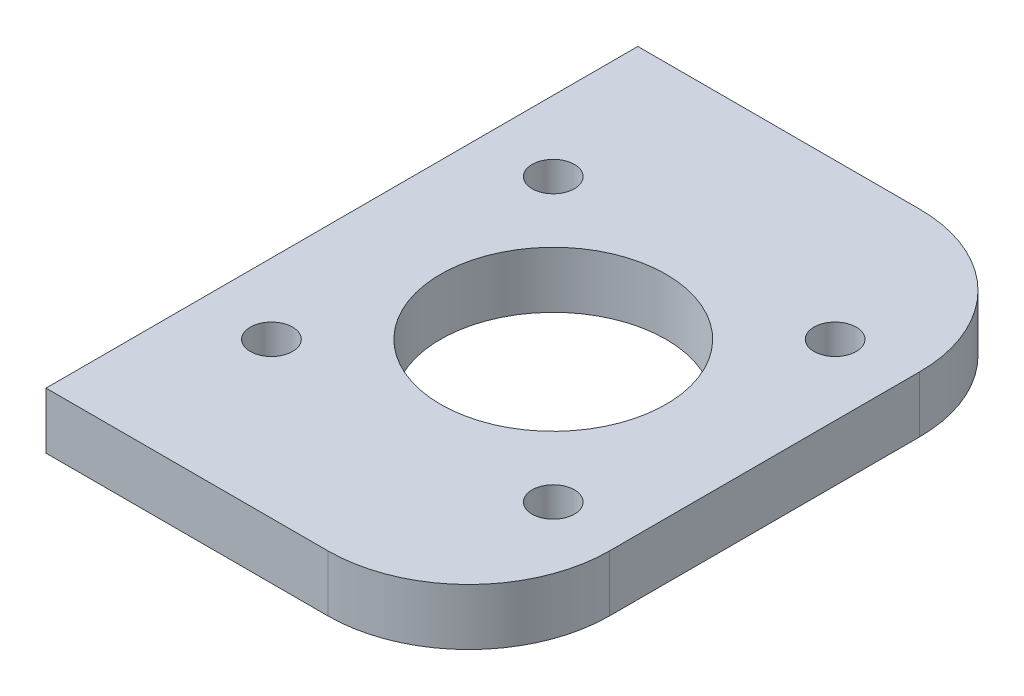
ISO-10303-21;
HEADER;
FILE_DESCRIPTION(('STEP AP214'),'2;1');
FILE_NAME('part.step','',(''),(''),'','','');
FILE_SCHEMA(('AUTOMOTIVE_DESIGN { 1 0 10303 214 1 1 1 1 }'));
ENDSEC;
DATA;
#1=APPLICATION_CONTEXT('core data for automotive mechanical design processes');
#2=APPLICATION_PROTOCOL_DEFINITION('international standard','automotive_design',2000,#1);
#3=PRODUCT_CONTEXT('',#1,'mechanical');
#4=PRODUCT('Part','Part','',(#3));
#5=PRODUCT_RELATED_PRODUCT_CATEGORY('part','',(#4));
#6=PRODUCT_DEFINITION_FORMATION('','',#4);
#7=PRODUCT_DEFINITION_CONTEXT('part definition',#1,'design');
#8=PRODUCT_DEFINITION('design','',#6,#7);
#9=PRODUCT_DEFINITION_SHAPE('','',#8);
#10=(LENGTH_UNIT() NAMED_UNIT(*) SI_UNIT(.MILLI.,.METRE.));
#11=(NAMED_UNIT(*) PLANE_ANGLE_UNIT() SI_UNIT($,.RADIAN.));
#12=(NAMED_UNIT(*) SI_UNIT($,.STERADIAN.) SOLID_ANGLE_UNIT());
#13=UNCERTAINTY_MEASURE_WITH_UNIT(LENGTH_MEASURE(1.E-05),#10,'distance_accuracy_value','');
#14=(GEOMETRIC_REPRESENTATION_CONTEXT(3) GLOBAL_UNCERTAINTY_ASSIGNED_CONTEXT((#13)) GLOBAL_UNIT_ASSIGNED_CONTEXT((#10,
#11,#12)) REPRESENTATION_CONTEXT('',''));
#15=CARTESIAN_POINT('',(0.,0.,0.));
#16=DIRECTION('',(0.,0.,1.));
#17=DIRECTION('',(1.,0.,0.));
#18=AXIS2_PLACEMENT_3D('',#15,#16,#17);
#19=CARTESIAN_POINT('',(0.,4.,0.));
#20=DIRECTION('',(0.,1.,0.));
#21=DIRECTION('',(0.,0.,1.));
#22=AXIS2_PLACEMENT_3D('',#19,#20,#21);
#23=PLANE('',#22);
#24=CARTESIAN_POINT('',(10.,4.,-10.));
#25=DIRECTION('',(0.,1.,0.));
#26=DIRECTION('',(0.,0.,1.));
#27=AXIS2_PLACEMENT_3D('',#24,#25,#26);
#28=CIRCLE('',#27,1.5);
#29=CARTESIAN_POINT('',(10.,4.,-8.5));
#30=VERTEX_POINT('',#29);
#31=EDGE_CURVE('E162',#30,#30,#28,.T.);
#32=ORIENTED_EDGE('',*,*,#31,.F.);
#33=EDGE_LOOP('',(#32));
#34=FACE_BOUND('',#33,.T.);
#35=CARTESIAN_POINT('',(10.,4.,10.));
#36=DIRECTION('',(0.,1.,0.));
#37=DIRECTION('',(0.,0.,1.));
#38=AXIS2_PLACEMENT_3D('',#35,#36,#37);
#39=CIRCLE('',#38,1.5);
#40=CARTESIAN_POINT('',(10.,4.,11.5));
#41=VERTEX_POINT('',#40);
#42=EDGE_CURVE('E157',#41,#41,#39,.T.);
#43=ORIENTED_EDGE('',*,*,#42,.F.);
#44=EDGE_LOOP('',(#43));
#45=FACE_BOUND('',#44,.T.);
#46=CARTESIAN_POINT('',(-10.,4.,10.));
#47=DIRECTION('',(0.,1.,0.));
#48=DIRECTION('',(0.,0.,1.));
#49=AXIS2_PLACEMENT_3D('',#46,#47,#48);
#50=CIRCLE('',#49,1.5);
#51=CARTESIAN_POINT('',(-10.,4.,11.5));
#52=VERTEX_POINT('',#51);
#53=EDGE_CURVE('E153',#52,#52,#50,.T.);
#54=ORIENTED_EDGE('',*,*,#53,.F.);
#55=EDGE_LOOP('',(#54));
#56=FACE_BOUND('',#55,.T.);
#57=CARTESIAN_POINT('',(-10.,4.,-10.));
#58=DIRECTION('',(0.,1.,0.));
#59=DIRECTION('',(0.,0.,1.));
#60=AXIS2_PLACEMENT_3D('',#57,#58,#59);
#61=CIRCLE('',#60,1.5);
#62=CARTESIAN_POINT('',(-10.,4.,-8.5));
#63=VERTEX_POINT('',#62);
#64=EDGE_CURVE('E149',#63,#63,#61,.T.);
#65=ORIENTED_EDGE('',*,*,#64,.F.);
#66=EDGE_LOOP('',(#65));
#67=FACE_BOUND('',#66,.T.);
#68=DIRECTION('',(0.,0.,-1.));
#69=VECTOR('',#68,1.);
#70=CARTESIAN_POINT('',(15.,4.,-21.));
#71=LINE('',#70,#69);
#72=CARTESIAN_POINT('',(15.,4.,11.));
#73=VERTEX_POINT('',#72);
#74=CARTESIAN_POINT('',(15.,4.,-11.));
#75=VERTEX_POINT('',#74);
#76=EDGE_CURVE('E101',#73,#75,#71,.T.);
#77=ORIENTED_EDGE('',*,*,#76,.T.);
#78=CARTESIAN_POINT('',(4.99999999999999,4.,-11.));
#79=DIRECTION('',(0.,1.,0.));
#80=DIRECTION('',(0.,0.,1.));
#81=AXIS2_PLACEMENT_3D('',#78,#79,#80);
#82=CIRCLE('',#81,10.);
#83=CARTESIAN_POINT('',(4.99999999999999,4.,-21.));
#84=VERTEX_POINT('',#83);
#85=EDGE_CURVE('E44',#75,#84,#82,.T.);
#86=ORIENTED_EDGE('',*,*,#85,.T.);
#87=DIRECTION('',(-1.,0.,0.));
#88=VECTOR('',#87,1.);
#89=CARTESIAN_POINT('',(-15.,4.,-21.));
#90=LINE('',#89,#88);
#91=CARTESIAN_POINT('',(-15.,4.,-21.));
#92=VERTEX_POINT('',#91);
#93=EDGE_CURVE('E91',#84,#92,#90,.T.);
#94=ORIENTED_EDGE('',*,*,#93,.T.);
#95=DIRECTION('',(0.,0.,1.));
#96=VECTOR('',#95,1.);
#97=CARTESIAN_POINT('',(-15.,4.,-21.));
#98=LINE('',#97,#96);
#99=CARTESIAN_POINT('',(-15.,4.,21.));
#100=VERTEX_POINT('',#99);
#101=EDGE_CURVE('E95',#92,#100,#98,.T.);
#102=ORIENTED_EDGE('',*,*,#101,.T.);
#103=DIRECTION('',(1.,0.,0.));
#104=VECTOR('',#103,1.);
#105=CARTESIAN_POINT('',(-15.,4.,21.));
#106=LINE('',#105,#104);
#107=CARTESIAN_POINT('',(5.,4.,21.));
#108=VERTEX_POINT('',#107);
#109=EDGE_CURVE('E115',#100,#108,#106,.T.);
#110=ORIENTED_EDGE('',*,*,#109,.T.);
#111=CARTESIAN_POINT('',(5.,4.,11.));
#112=DIRECTION('',(0.,1.,0.));
#113=DIRECTION('',(0.,0.,1.));
#114=AXIS2_PLACEMENT_3D('',#111,#112,#113);
#115=CIRCLE('',#114,10.);
#116=EDGE_CURVE('E128',#108,#73,#115,.T.);
#117=ORIENTED_EDGE('',*,*,#116,.T.);
#118=EDGE_LOOP('',(#77,#86,#94,#102,#110,#117));
#119=FACE_BOUND('',#118,.T.);
#120=CARTESIAN_POINT('',(0.,4.,0.));
#121=DIRECTION('',(0.,1.,0.));
#122=DIRECTION('',(0.,0.,1.));
#123=AXIS2_PLACEMENT_3D('',#120,#121,#122);
#124=CIRCLE('',#123,8.);
#125=CARTESIAN_POINT('',(0.,4.,8.));
#126=VERTEX_POINT('',#125);
#127=EDGE_CURVE('E144',#126,#126,#124,.T.);
#128=ORIENTED_EDGE('',*,*,#127,.F.);
#129=EDGE_LOOP('',(#128));
#130=FACE_BOUND('',#129,.T.);
#131=ADVANCED_FACE('F35',(#34,#45,#56,#67,#119,#130),#23,.T.);
#132=CARTESIAN_POINT('',(0.,0.,0.));
#133=DIRECTION('',(0.,1.,0.));
#134=DIRECTION('',(0.,0.,1.));
#135=AXIS2_PLACEMENT_3D('',#132,#133,#134);
#136=PLANE('',#135);
#137=CARTESIAN_POINT('',(10.,0.,-10.));
#138=DIRECTION('',(0.,1.,0.));
#139=DIRECTION('',(0.,0.,1.));
#140=AXIS2_PLACEMENT_3D('',#137,#138,#139);
#141=CIRCLE('',#140,1.5);
#142=CARTESIAN_POINT('',(10.,0.,-8.5));
#143=VERTEX_POINT('',#142);
#144=EDGE_CURVE('E39',#143,#143,#141,.T.);
#145=ORIENTED_EDGE('',*,*,#144,.T.);
#146=EDGE_LOOP('',(#145));
#147=FACE_BOUND('',#146,.T.);
#148=CARTESIAN_POINT('',(10.,0.,10.));
#149=DIRECTION('',(0.,1.,0.));
#150=DIRECTION('',(0.,0.,1.));
#151=AXIS2_PLACEMENT_3D('',#148,#149,#150);
#152=CIRCLE('',#151,1.5);
#153=CARTESIAN_POINT('',(10.,0.,11.5));
#154=VERTEX_POINT('',#153);
#155=EDGE_CURVE('E169',#154,#154,#152,.T.);
#156=ORIENTED_EDGE('',*,*,#155,.T.);
#157=EDGE_LOOP('',(#156));
#158=FACE_BOUND('',#157,.T.);
#159=CARTESIAN_POINT('',(-10.,0.,10.));
#160=DIRECTION('',(0.,1.,0.));
#161=DIRECTION('',(0.,0.,1.));
#162=AXIS2_PLACEMENT_3D('',#159,#160,#161);
#163=CIRCLE('',#162,1.5);
#164=CARTESIAN_POINT('',(-10.,0.,11.5));
#165=VERTEX_POINT('',#164);
#166=EDGE_CURVE('E165',#165,#165,#163,.T.);
#167=ORIENTED_EDGE('',*,*,#166,.T.);
#168=EDGE_LOOP('',(#167));
#169=FACE_BOUND('',#168,.T.);
#170=CARTESIAN_POINT('',(-10.,0.,-10.));
#171=DIRECTION('',(0.,1.,0.));
#172=DIRECTION('',(0.,0.,1.));
#173=AXIS2_PLACEMENT_3D('',#170,#171,#172);
#174=CIRCLE('',#173,1.5);
#175=CARTESIAN_POINT('',(-10.,0.,-8.5));
#176=VERTEX_POINT('',#175);
#177=EDGE_CURVE('E145',#176,#176,#174,.T.);
#178=ORIENTED_EDGE('',*,*,#177,.T.);
#179=EDGE_LOOP('',(#178));
#180=FACE_BOUND('',#179,.T.);
#181=DIRECTION('',(-1.,0.,0.));
#182=VECTOR('',#181,1.);
#183=CARTESIAN_POINT('',(-15.,0.,-21.));
#184=LINE('',#183,#182);
#185=CARTESIAN_POINT('',(4.99999999999999,0.,-21.));
#186=VERTEX_POINT('',#185);
#187=CARTESIAN_POINT('',(-15.,0.,-21.));
#188=VERTEX_POINT('',#187);
#189=EDGE_CURVE('E107',#186,#188,#184,.T.);
#190=ORIENTED_EDGE('',*,*,#189,.F.);
#191=CARTESIAN_POINT('',(4.99999999999999,0.,-11.));
#192=DIRECTION('',(0.,1.,0.));
#193=DIRECTION('',(0.,0.,1.));
#194=AXIS2_PLACEMENT_3D('',#191,#192,#193);
#195=CIRCLE('',#194,10.);
#196=CARTESIAN_POINT('',(15.,0.,-11.));
#197=VERTEX_POINT('',#196);
#198=EDGE_CURVE('E234',#186,#197,#195,.F.);
#199=ORIENTED_EDGE('',*,*,#198,.T.);
#200=DIRECTION('',(0.,0.,-1.));
#201=VECTOR('',#200,1.);
#202=CARTESIAN_POINT('',(15.,0.,-21.));
#203=LINE('',#202,#201);
#204=CARTESIAN_POINT('',(15.,0.,11.));
#205=VERTEX_POINT('',#204);
#206=EDGE_CURVE('E148',#205,#197,#203,.T.);
#207=ORIENTED_EDGE('',*,*,#206,.F.);
#208=CARTESIAN_POINT('',(5.,0.,11.));
#209=DIRECTION('',(0.,1.,0.));
#210=DIRECTION('',(0.,0.,1.));
#211=AXIS2_PLACEMENT_3D('',#208,#209,#210);
#212=CIRCLE('',#211,10.);
#213=CARTESIAN_POINT('',(5.,0.,21.));
#214=VERTEX_POINT('',#213);
#215=EDGE_CURVE('E235',#205,#214,#212,.F.);
#216=ORIENTED_EDGE('',*,*,#215,.T.);
#217=DIRECTION('',(1.,0.,0.));
#218=VECTOR('',#217,1.);
#219=CARTESIAN_POINT('',(-15.,0.,21.));
#220=LINE('',#219,#218);
#221=CARTESIAN_POINT('',(-15.,0.,21.));
#222=VERTEX_POINT('',#221);
#223=EDGE_CURVE('E141',#222,#214,#220,.T.);
#224=ORIENTED_EDGE('',*,*,#223,.F.);
#225=DIRECTION('',(0.,0.,1.));
#226=VECTOR('',#225,1.);
#227=CARTESIAN_POINT('',(-15.,0.,-21.));
#228=LINE('',#227,#226);
#229=EDGE_CURVE('E248',#188,#222,#228,.T.);
#230=ORIENTED_EDGE('',*,*,#229,.F.);
#231=EDGE_LOOP('',(#190,#199,#207,#216,#224,#230));
#232=FACE_BOUND('',#231,.T.);
#233=CARTESIAN_POINT('',(0.,0.,0.));
#234=DIRECTION('',(0.,1.,0.));
#235=DIRECTION('',(0.,0.,1.));
#236=AXIS2_PLACEMENT_3D('',#233,#234,#235);
#237=CIRCLE('',#236,8.);
#238=CARTESIAN_POINT('',(0.,0.,8.));
#239=VERTEX_POINT('',#238);
#240=EDGE_CURVE('E142',#239,#239,#237,.T.);
#241=ORIENTED_EDGE('',*,*,#240,.T.);
#242=EDGE_LOOP('',(#241));
#243=FACE_BOUND('',#242,.T.);
#244=ADVANCED_FACE('F179',(#147,#158,#169,#180,#232,#243),#136,.F.);
#245=CARTESIAN_POINT('',(15.,4.,-21.));
#246=DIRECTION('',(-1.,0.,0.));
#247=DIRECTION('',(0.,0.,1.));
#248=AXIS2_PLACEMENT_3D('',#245,#246,#247);
#249=PLANE('',#248);
#250=ORIENTED_EDGE('',*,*,#206,.T.);
#251=DIRECTION('',(0.,-1.,0.));
#252=VECTOR('',#251,1.);
#253=CARTESIAN_POINT('',(15.,4.,-11.));
#254=LINE('',#253,#252);
#255=EDGE_CURVE('E58',#197,#75,#254,.F.);
#256=ORIENTED_EDGE('',*,*,#255,.T.);
#257=ORIENTED_EDGE('',*,*,#76,.F.);
#258=DIRECTION('',(0.,-1.,0.));
#259=VECTOR('',#258,1.);
#260=CARTESIAN_POINT('',(15.,4.,11.));
#261=LINE('',#260,#259);
#262=EDGE_CURVE('E240',#73,#205,#261,.T.);
#263=ORIENTED_EDGE('',*,*,#262,.T.);
#264=EDGE_LOOP('',(#250,#256,#257,#263));
#265=FACE_BOUND('',#264,.T.);
#266=ADVANCED_FACE('F220',(#265),#249,.F.);
#267=CARTESIAN_POINT('',(-15.,4.,-21.));
#268=DIRECTION('',(0.,0.,1.));
#269=DIRECTION('',(1.,0.,0.));
#270=AXIS2_PLACEMENT_3D('',#267,#268,#269);
#271=PLANE('',#270);
#272=ORIENTED_EDGE('',*,*,#93,.F.);
#273=DIRECTION('',(0.,-1.,0.));
#274=VECTOR('',#273,1.);
#275=CARTESIAN_POINT('',(4.99999999999999,4.,-21.));
#276=LINE('',#275,#274);
#277=EDGE_CURVE('E110',#84,#186,#276,.T.);
#278=ORIENTED_EDGE('',*,*,#277,.T.);
#279=ORIENTED_EDGE('',*,*,#189,.T.);
#280=DIRECTION('',(0.,-1.,0.));
#281=VECTOR('',#280,1.);
#282=CARTESIAN_POINT('',(-15.,4.,-21.));
#283=LINE('',#282,#281);
#284=EDGE_CURVE('E104',#92,#188,#283,.T.);
#285=ORIENTED_EDGE('',*,*,#284,.F.);
#286=EDGE_LOOP('',(#272,#278,#279,#285));
#287=FACE_BOUND('',#286,.T.);
#288=ADVANCED_FACE('F105',(#287),#271,.F.);
#289=CARTESIAN_POINT('',(-15.,4.,-21.));
#290=DIRECTION('',(1.,0.,0.));
#291=DIRECTION('',(0.,0.,-1.));
#292=AXIS2_PLACEMENT_3D('',#289,#290,#291);
#293=PLANE('',#292);
#294=ORIENTED_EDGE('',*,*,#229,.T.);
#295=DIRECTION('',(0.,-1.,0.));
#296=VECTOR('',#295,1.);
#297=CARTESIAN_POINT('',(-15.,4.,21.));
#298=LINE('',#297,#296);
#299=EDGE_CURVE('E111',#100,#222,#298,.T.);
#300=ORIENTED_EDGE('',*,*,#299,.F.);
#301=ORIENTED_EDGE('',*,*,#101,.F.);
#302=ORIENTED_EDGE('',*,*,#284,.T.);
#303=EDGE_LOOP('',(#294,#300,#301,#302));
#304=FACE_BOUND('',#303,.T.);
#305=ADVANCED_FACE('F113',(#304),#293,.F.);
#306=CARTESIAN_POINT('',(-15.,4.,21.));
#307=DIRECTION('',(0.,0.,-1.));
#308=DIRECTION('',(-1.,0.,0.));
#309=AXIS2_PLACEMENT_3D('',#306,#307,#308);
#310=PLANE('',#309);
#311=ORIENTED_EDGE('',*,*,#223,.T.);
#312=DIRECTION('',(0.,-1.,0.));
#313=VECTOR('',#312,1.);
#314=CARTESIAN_POINT('',(5.,4.,21.));
#315=LINE('',#314,#313);
#316=EDGE_CURVE('E12',#214,#108,#315,.F.);
#317=ORIENTED_EDGE('',*,*,#316,.T.);
#318=ORIENTED_EDGE('',*,*,#109,.F.);
#319=ORIENTED_EDGE('',*,*,#299,.T.);
#320=EDGE_LOOP('',(#311,#317,#318,#319));
#321=FACE_BOUND('',#320,.T.);
#322=ADVANCED_FACE('F215',(#321),#310,.F.);
#323=CARTESIAN_POINT('',(0.,4.,0.));
#324=DIRECTION('',(0.,-1.,0.));
#325=DIRECTION('',(0.,0.,-1.));
#326=AXIS2_PLACEMENT_3D('',#323,#324,#325);
#327=CYLINDRICAL_SURFACE('',#326,8.);
#328=ORIENTED_EDGE('',*,*,#127,.T.);
#329=EDGE_LOOP('',(#328));
#330=FACE_BOUND('',#329,.T.);
#331=ORIENTED_EDGE('',*,*,#240,.F.);
#332=EDGE_LOOP('',(#331));
#333=FACE_BOUND('',#332,.T.);
#334=ADVANCED_FACE('F212',(#330,#333),#327,.F.);
#335=CARTESIAN_POINT('',(4.99999999999999,4.,-11.));
#336=DIRECTION('',(0.,-1.,0.));
#337=DIRECTION('',(0.,0.,-1.));
#338=AXIS2_PLACEMENT_3D('',#335,#336,#337);
#339=CYLINDRICAL_SURFACE('',#338,10.);
#340=ORIENTED_EDGE('',*,*,#85,.F.);
#341=ORIENTED_EDGE('',*,*,#255,.F.);
#342=ORIENTED_EDGE('',*,*,#198,.F.);
#343=ORIENTED_EDGE('',*,*,#277,.F.);
#344=EDGE_LOOP('',(#340,#341,#342,#343));
#345=FACE_BOUND('',#344,.T.);
#346=ADVANCED_FACE('F214',(#345),#339,.T.);
#347=CARTESIAN_POINT('',(5.,4.,11.));
#348=DIRECTION('',(0.,-1.,0.));
#349=DIRECTION('',(0.,0.,-1.));
#350=AXIS2_PLACEMENT_3D('',#347,#348,#349);
#351=CYLINDRICAL_SURFACE('',#350,10.);
#352=ORIENTED_EDGE('',*,*,#116,.F.);
#353=ORIENTED_EDGE('',*,*,#316,.F.);
#354=ORIENTED_EDGE('',*,*,#215,.F.);
#355=ORIENTED_EDGE('',*,*,#262,.F.);
#356=EDGE_LOOP('',(#352,#353,#354,#355));
#357=FACE_BOUND('',#356,.T.);
#358=ADVANCED_FACE('F37',(#357),#351,.T.);
#359=CARTESIAN_POINT('',(-10.,-2.,-10.));
#360=DIRECTION('',(0.,1.,0.));
#361=DIRECTION('',(0.,0.,1.));
#362=AXIS2_PLACEMENT_3D('',#359,#360,#361);
#363=CYLINDRICAL_SURFACE('',#362,1.5);
#364=ORIENTED_EDGE('',*,*,#64,.T.);
#365=EDGE_LOOP('',(#364));
#366=FACE_BOUND('',#365,.T.);
#367=ORIENTED_EDGE('',*,*,#177,.F.);
#368=EDGE_LOOP('',(#367));
#369=FACE_BOUND('',#368,.T.);
#370=ADVANCED_FACE('F186',(#366,#369),#363,.F.);
#371=CARTESIAN_POINT('',(-10.,-2.,10.));
#372=DIRECTION('',(0.,1.,0.));
#373=DIRECTION('',(0.,0.,1.));
#374=AXIS2_PLACEMENT_3D('',#371,#372,#373);
#375=CYLINDRICAL_SURFACE('',#374,1.5);
#376=ORIENTED_EDGE('',*,*,#53,.T.);
#377=EDGE_LOOP('',(#376));
#378=FACE_BOUND('',#377,.T.);
#379=ORIENTED_EDGE('',*,*,#166,.F.);
#380=EDGE_LOOP('',(#379));
#381=FACE_BOUND('',#380,.T.);
#382=ADVANCED_FACE('F189',(#378,#381),#375,.F.);
#383=CARTESIAN_POINT('',(10.,-2.,10.));
#384=DIRECTION('',(0.,1.,0.));
#385=DIRECTION('',(0.,0.,1.));
#386=AXIS2_PLACEMENT_3D('',#383,#384,#385);
#387=CYLINDRICAL_SURFACE('',#386,1.5);
#388=ORIENTED_EDGE('',*,*,#42,.T.);
#389=EDGE_LOOP('',(#388));
#390=FACE_BOUND('',#389,.T.);
#391=ORIENTED_EDGE('',*,*,#155,.F.);
#392=EDGE_LOOP('',(#391));
#393=FACE_BOUND('',#392,.T.);
#394=ADVANCED_FACE('F174',(#390,#393),#387,.F.);
#395=CARTESIAN_POINT('',(10.,-2.,-10.));
#396=DIRECTION('',(0.,1.,0.));
#397=DIRECTION('',(0.,0.,1.));
#398=AXIS2_PLACEMENT_3D('',#395,#396,#397);
#399=CYLINDRICAL_SURFACE('',#398,1.5);
#400=ORIENTED_EDGE('',*,*,#31,.T.);
#401=EDGE_LOOP('',(#400));
#402=FACE_BOUND('',#401,.T.);
#403=ORIENTED_EDGE('',*,*,#144,.F.);
#404=EDGE_LOOP('',(#403));
#405=FACE_BOUND('',#404,.T.);
#406=ADVANCED_FACE('F201',(#402,#405),#399,.F.);
#407=CLOSED_SHELL('',(#131,#244,#266,#288,#305,#322,#334,#346,#358,#370,#382,#394,#406));
#408=MANIFOLD_SOLID_BREP('B2',#407);
#409=ADVANCED_BREP_SHAPE_REPRESENTATION('',(#18,#408),#14);
#410=SHAPE_DEFINITION_REPRESENTATION(#9,#409);
ENDSEC;
END-ISO-10303-21;
